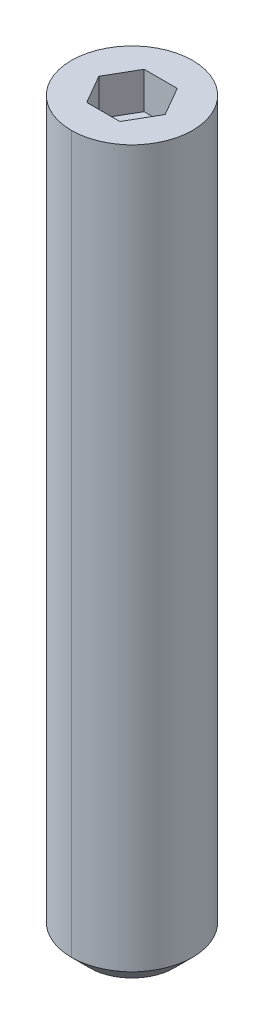
ISO-10303-21;
HEADER;
FILE_DESCRIPTION(('STEP AP214'),'2;1');
FILE_NAME('part.step','',(''),(''),'','','');
FILE_SCHEMA(('AUTOMOTIVE_DESIGN { 1 0 10303 214 1 1 1 1 }'));
ENDSEC;
DATA;
#1=APPLICATION_CONTEXT('core data for automotive mechanical design processes');
#2=APPLICATION_PROTOCOL_DEFINITION('international standard','automotive_design',2000,#1);
#3=PRODUCT_CONTEXT('',#1,'mechanical');
#4=PRODUCT('Part','Part','',(#3));
#5=PRODUCT_RELATED_PRODUCT_CATEGORY('part','',(#4));
#6=PRODUCT_DEFINITION_FORMATION('','',#4);
#7=PRODUCT_DEFINITION_CONTEXT('part definition',#1,'design');
#8=PRODUCT_DEFINITION('design','',#6,#7);
#9=PRODUCT_DEFINITION_SHAPE('','',#8);
#10=(LENGTH_UNIT() NAMED_UNIT(*) SI_UNIT(.MILLI.,.METRE.));
#11=(NAMED_UNIT(*) PLANE_ANGLE_UNIT() SI_UNIT($,.RADIAN.));
#12=(NAMED_UNIT(*) SI_UNIT($,.STERADIAN.) SOLID_ANGLE_UNIT());
#13=UNCERTAINTY_MEASURE_WITH_UNIT(LENGTH_MEASURE(1.E-05),#10,'distance_accuracy_value','');
#14=(GEOMETRIC_REPRESENTATION_CONTEXT(3) GLOBAL_UNCERTAINTY_ASSIGNED_CONTEXT((#13)) GLOBAL_UNIT_ASSIGNED_CONTEXT((#10,
#11,#12)) REPRESENTATION_CONTEXT('',''));
#15=CARTESIAN_POINT('',(0.,0.,0.));
#16=DIRECTION('',(0.,0.,1.));
#17=DIRECTION('',(1.,0.,0.));
#18=AXIS2_PLACEMENT_3D('',#15,#16,#17);
#19=CARTESIAN_POINT('',(-1.14567944042316,11.43,0.));
#20=DIRECTION('',(0.,1.,0.));
#21=DIRECTION('',(1.,0.,0.));
#22=AXIS2_PLACEMENT_3D('',#19,#20,#21);
#23=PLANE('',#22);
#24=DIRECTION('',(-0.5,0.,0.866025403784439));
#25=VECTOR('',#24,1.);
#26=CARTESIAN_POINT('',(-0.572839720211583,11.43,-0.9921875));
#27=LINE('',#26,#25);
#28=CARTESIAN_POINT('',(-0.572839720211583,11.43,-0.9921875));
#29=VERTEX_POINT('',#28);
#30=CARTESIAN_POINT('',(-1.14567944042316,11.43,0.));
#31=VERTEX_POINT('',#30);
#32=EDGE_CURVE('E138',#29,#31,#27,.T.);
#33=ORIENTED_EDGE('',*,*,#32,.T.);
#34=DIRECTION('',(0.5,0.,0.866025403784439));
#35=VECTOR('',#34,1.);
#36=CARTESIAN_POINT('',(-1.14567944042316,11.43,0.));
#37=LINE('',#36,#35);
#38=CARTESIAN_POINT('',(-0.572839720211581,11.43,0.9921875));
#39=VERTEX_POINT('',#38);
#40=EDGE_CURVE('E11',#31,#39,#37,.T.);
#41=ORIENTED_EDGE('',*,*,#40,.T.);
#42=DIRECTION('',(1.,0.,0.));
#43=VECTOR('',#42,1.);
#44=CARTESIAN_POINT('',(-0.572839720211581,11.43,0.9921875));
#45=LINE('',#44,#43);
#46=CARTESIAN_POINT('',(0.572839720211582,11.43,0.9921875));
#47=VERTEX_POINT('',#46);
#48=EDGE_CURVE('E162',#39,#47,#45,.T.);
#49=ORIENTED_EDGE('',*,*,#48,.T.);
#50=DIRECTION('',(0.5,0.,-0.866025403784439));
#51=VECTOR('',#50,1.);
#52=CARTESIAN_POINT('',(0.572839720211582,11.43,0.9921875));
#53=LINE('',#52,#51);
#54=CARTESIAN_POINT('',(1.14567944042316,11.43,0.));
#55=VERTEX_POINT('',#54);
#56=EDGE_CURVE('E148',#47,#55,#53,.T.);
#57=ORIENTED_EDGE('',*,*,#56,.T.);
#58=DIRECTION('',(-0.5,0.,-0.866025403784438));
#59=VECTOR('',#58,1.);
#60=CARTESIAN_POINT('',(1.14567944042316,11.43,0.));
#61=LINE('',#60,#59);
#62=CARTESIAN_POINT('',(0.572839720211582,11.43,-0.9921875));
#63=VERTEX_POINT('',#62);
#64=EDGE_CURVE('E159',#55,#63,#61,.T.);
#65=ORIENTED_EDGE('',*,*,#64,.T.);
#66=DIRECTION('',(-1.,0.,0.));
#67=VECTOR('',#66,1.);
#68=CARTESIAN_POINT('',(0.572839720211582,11.43,-0.9921875));
#69=LINE('',#68,#67);
#70=EDGE_CURVE('E131',#63,#29,#69,.T.);
#71=ORIENTED_EDGE('',*,*,#70,.T.);
#72=EDGE_LOOP('',(#33,#41,#49,#57,#65,#71));
#73=FACE_BOUND('',#72,.T.);
#74=ADVANCED_FACE('F17',(#73),#23,.T.);
#75=CARTESIAN_POINT('',(-1.14567944042316,11.43,0.));
#76=DIRECTION('',(-0.866025403784438,0.,0.5));
#77=DIRECTION('',(0.,1.,0.));
#78=AXIS2_PLACEMENT_3D('',#75,#76,#77);
#79=PLANE('',#78);
#80=DIRECTION('',(0.5,0.,0.866025403784439));
#81=VECTOR('',#80,1.);
#82=CARTESIAN_POINT('',(-1.14567944042316,12.7,0.));
#83=LINE('',#82,#81);
#84=CARTESIAN_POINT('',(-1.14567944042316,12.7,0.));
#85=VERTEX_POINT('',#84);
#86=CARTESIAN_POINT('',(-0.572839720211581,12.7,0.9921875));
#87=VERTEX_POINT('',#86);
#88=EDGE_CURVE('E168',#85,#87,#83,.T.);
#89=ORIENTED_EDGE('',*,*,#88,.T.);
#90=DIRECTION('',(0.,1.,0.));
#91=VECTOR('',#90,1.);
#92=CARTESIAN_POINT('',(-0.572839720211581,11.43,0.9921875));
#93=LINE('',#92,#91);
#94=EDGE_CURVE('E28',#39,#87,#93,.T.);
#95=ORIENTED_EDGE('',*,*,#94,.F.);
#96=ORIENTED_EDGE('',*,*,#40,.F.);
#97=DIRECTION('',(0.,1.,0.));
#98=VECTOR('',#97,1.);
#99=CARTESIAN_POINT('',(-1.14567944042316,11.43,0.));
#100=LINE('',#99,#98);
#101=EDGE_CURVE('E165',#31,#85,#100,.T.);
#102=ORIENTED_EDGE('',*,*,#101,.T.);
#103=EDGE_LOOP('',(#89,#95,#96,#102));
#104=FACE_BOUND('',#103,.T.);
#105=ADVANCED_FACE('F240',(#104),#79,.F.);
#106=CARTESIAN_POINT('',(-0.572839720211581,11.43,0.9921875));
#107=DIRECTION('',(0.,0.,1.));
#108=DIRECTION('',(1.,0.,0.));
#109=AXIS2_PLACEMENT_3D('',#106,#107,#108);
#110=PLANE('',#109);
#111=DIRECTION('',(1.,0.,0.));
#112=VECTOR('',#111,1.);
#113=CARTESIAN_POINT('',(-0.572839720211581,12.7,0.9921875));
#114=LINE('',#113,#112);
#115=CARTESIAN_POINT('',(0.572839720211582,12.7,0.9921875));
#116=VERTEX_POINT('',#115);
#117=EDGE_CURVE('E158',#87,#116,#114,.T.);
#118=ORIENTED_EDGE('',*,*,#117,.T.);
#119=DIRECTION('',(0.,1.,0.));
#120=VECTOR('',#119,1.);
#121=CARTESIAN_POINT('',(0.572839720211582,11.43,0.9921875));
#122=LINE('',#121,#120);
#123=EDGE_CURVE('E152',#47,#116,#122,.T.);
#124=ORIENTED_EDGE('',*,*,#123,.F.);
#125=ORIENTED_EDGE('',*,*,#48,.F.);
#126=ORIENTED_EDGE('',*,*,#94,.T.);
#127=EDGE_LOOP('',(#118,#124,#125,#126));
#128=FACE_BOUND('',#127,.T.);
#129=ADVANCED_FACE('F210',(#128),#110,.F.);
#130=CARTESIAN_POINT('',(1.14567944042316,11.43,0.));
#131=DIRECTION('',(0.866025403784438,0.,-0.5));
#132=DIRECTION('',(0.,-1.,0.));
#133=AXIS2_PLACEMENT_3D('',#130,#131,#132);
#134=PLANE('',#133);
#135=DIRECTION('',(-0.5,0.,-0.866025403784438));
#136=VECTOR('',#135,1.);
#137=CARTESIAN_POINT('',(1.14567944042316,12.7,0.));
#138=LINE('',#137,#136);
#139=CARTESIAN_POINT('',(1.14567944042316,12.7,0.));
#140=VERTEX_POINT('',#139);
#141=CARTESIAN_POINT('',(0.572839720211582,12.7,-0.9921875));
#142=VERTEX_POINT('',#141);
#143=EDGE_CURVE('E21',#140,#142,#138,.T.);
#144=ORIENTED_EDGE('',*,*,#143,.T.);
#145=DIRECTION('',(0.,1.,0.));
#146=VECTOR('',#145,1.);
#147=CARTESIAN_POINT('',(0.572839720211582,11.43,-0.9921875));
#148=LINE('',#147,#146);
#149=EDGE_CURVE('E134',#63,#142,#148,.T.);
#150=ORIENTED_EDGE('',*,*,#149,.F.);
#151=ORIENTED_EDGE('',*,*,#64,.F.);
#152=DIRECTION('',(0.,1.,0.));
#153=VECTOR('',#152,1.);
#154=CARTESIAN_POINT('',(1.14567944042316,11.43,0.));
#155=LINE('',#154,#153);
#156=EDGE_CURVE('E153',#55,#140,#155,.T.);
#157=ORIENTED_EDGE('',*,*,#156,.T.);
#158=EDGE_LOOP('',(#144,#150,#151,#157));
#159=FACE_BOUND('',#158,.T.);
#160=ADVANCED_FACE('F230',(#159),#134,.F.);
#161=CARTESIAN_POINT('',(0.572839720211582,11.43,-0.9921875));
#162=DIRECTION('',(0.,0.,-1.));
#163=DIRECTION('',(0.,-1.,0.));
#164=AXIS2_PLACEMENT_3D('',#161,#162,#163);
#165=PLANE('',#164);
#166=DIRECTION('',(-1.,0.,0.));
#167=VECTOR('',#166,1.);
#168=CARTESIAN_POINT('',(0.572839720211582,12.7,-0.9921875));
#169=LINE('',#168,#167);
#170=CARTESIAN_POINT('',(-0.572839720211583,12.7,-0.9921875));
#171=VERTEX_POINT('',#170);
#172=EDGE_CURVE('E178',#142,#171,#169,.T.);
#173=ORIENTED_EDGE('',*,*,#172,.T.);
#174=DIRECTION('',(0.,1.,0.));
#175=VECTOR('',#174,1.);
#176=CARTESIAN_POINT('',(-0.572839720211583,11.43,-0.9921875));
#177=LINE('',#176,#175);
#178=EDGE_CURVE('E135',#29,#171,#177,.T.);
#179=ORIENTED_EDGE('',*,*,#178,.F.);
#180=ORIENTED_EDGE('',*,*,#70,.F.);
#181=ORIENTED_EDGE('',*,*,#149,.T.);
#182=EDGE_LOOP('',(#173,#179,#180,#181));
#183=FACE_BOUND('',#182,.T.);
#184=ADVANCED_FACE('F234',(#183),#165,.F.);
#185=CARTESIAN_POINT('',(-0.572839720211583,11.43,-0.9921875));
#186=DIRECTION('',(-0.866025403784439,0.,-0.5));
#187=DIRECTION('',(-0.5,0.,0.866025403784439));
#188=AXIS2_PLACEMENT_3D('',#185,#186,#187);
#189=PLANE('',#188);
#190=DIRECTION('',(-0.5,0.,0.866025403784439));
#191=VECTOR('',#190,1.);
#192=CARTESIAN_POINT('',(-0.572839720211583,12.7,-0.9921875));
#193=LINE('',#192,#191);
#194=EDGE_CURVE('E182',#171,#85,#193,.T.);
#195=ORIENTED_EDGE('',*,*,#194,.T.);
#196=ORIENTED_EDGE('',*,*,#101,.F.);
#197=ORIENTED_EDGE('',*,*,#32,.F.);
#198=ORIENTED_EDGE('',*,*,#178,.T.);
#199=EDGE_LOOP('',(#195,#196,#197,#198));
#200=FACE_BOUND('',#199,.T.);
#201=ADVANCED_FACE('F238',(#200),#189,.F.);
#202=CARTESIAN_POINT('',(0.572839720211582,11.43,0.9921875));
#203=DIRECTION('',(0.866025403784439,0.,0.5));
#204=DIRECTION('',(0.,-1.,0.));
#205=AXIS2_PLACEMENT_3D('',#202,#203,#204);
#206=PLANE('',#205);
#207=DIRECTION('',(0.5,0.,-0.866025403784439));
#208=VECTOR('',#207,1.);
#209=CARTESIAN_POINT('',(0.572839720211582,12.7,0.9921875));
#210=LINE('',#209,#208);
#211=EDGE_CURVE('E154',#116,#140,#210,.T.);
#212=ORIENTED_EDGE('',*,*,#211,.T.);
#213=ORIENTED_EDGE('',*,*,#156,.F.);
#214=ORIENTED_EDGE('',*,*,#56,.F.);
#215=ORIENTED_EDGE('',*,*,#123,.T.);
#216=EDGE_LOOP('',(#212,#213,#214,#215));
#217=FACE_BOUND('',#216,.T.);
#218=ADVANCED_FACE('F222',(#217),#206,.F.);
#219=CARTESIAN_POINT('',(0.,12.7,0.));
#220=DIRECTION('',(0.,1.,0.));
#221=DIRECTION('',(1.,0.,0.));
#222=AXIS2_PLACEMENT_3D('',#219,#220,#221);
#223=PLANE('',#222);
#224=ORIENTED_EDGE('',*,*,#194,.F.);
#225=ORIENTED_EDGE('',*,*,#172,.F.);
#226=ORIENTED_EDGE('',*,*,#143,.F.);
#227=ORIENTED_EDGE('',*,*,#211,.F.);
#228=ORIENTED_EDGE('',*,*,#117,.F.);
#229=ORIENTED_EDGE('',*,*,#88,.F.);
#230=EDGE_LOOP('',(#224,#225,#226,#227,#228,#229));
#231=FACE_BOUND('',#230,.T.);
#232=CARTESIAN_POINT('',(0.,12.7,0.));
#233=DIRECTION('',(0.,1.,0.));
#234=DIRECTION('',(0.,0.,1.));
#235=AXIS2_PLACEMENT_3D('',#232,#233,#234);
#236=CIRCLE('',#235,2.0955);
#237=CARTESIAN_POINT('',(0.,12.7,-2.0955));
#238=VERTEX_POINT('',#237);
#239=CARTESIAN_POINT('',(0.,12.7,2.0955));
#240=VERTEX_POINT('',#239);
#241=EDGE_CURVE('E142',#238,#240,#236,.T.);
#242=ORIENTED_EDGE('',*,*,#241,.T.);
#243=CARTESIAN_POINT('',(0.,12.7,0.));
#244=DIRECTION('',(0.,1.,0.));
#245=DIRECTION('',(0.,0.,1.));
#246=AXIS2_PLACEMENT_3D('',#243,#244,#245);
#247=CIRCLE('',#246,2.0955);
#248=EDGE_CURVE('E141',#240,#238,#247,.T.);
#249=ORIENTED_EDGE('',*,*,#248,.T.);
#250=EDGE_LOOP('',(#242,#249));
#251=FACE_BOUND('',#250,.T.);
#252=ADVANCED_FACE('F19',(#231,#251),#223,.T.);
#253=CARTESIAN_POINT('',(0.,12.7,0.));
#254=DIRECTION('',(0.,-1.,0.));
#255=DIRECTION('',(0.,0.,-1.));
#256=AXIS2_PLACEMENT_3D('',#253,#254,#255);
#257=CYLINDRICAL_SURFACE('',#256,2.0955);
#258=ORIENTED_EDGE('',*,*,#248,.F.);
#259=DIRECTION('',(0.,-1.,0.));
#260=VECTOR('',#259,1.);
#261=CARTESIAN_POINT('',(0.,12.7,2.0955));
#262=LINE('',#261,#260);
#263=CARTESIAN_POINT('',(0.,-12.065,2.0955));
#264=VERTEX_POINT('',#263);
#265=EDGE_CURVE('E147',#240,#264,#262,.T.);
#266=ORIENTED_EDGE('',*,*,#265,.T.);
#267=CARTESIAN_POINT('',(0.,-12.065,0.));
#268=DIRECTION('',(0.,1.,0.));
#269=DIRECTION('',(0.,0.,1.));
#270=AXIS2_PLACEMENT_3D('',#267,#268,#269);
#271=CIRCLE('',#270,2.0955);
#272=CARTESIAN_POINT('',(0.,-12.065,-2.0955));
#273=VERTEX_POINT('',#272);
#274=EDGE_CURVE('E116',#264,#273,#271,.T.);
#275=ORIENTED_EDGE('',*,*,#274,.T.);
#276=DIRECTION('',(0.,-1.,0.));
#277=VECTOR('',#276,1.);
#278=CARTESIAN_POINT('',(0.,12.7,-2.0955));
#279=LINE('',#278,#277);
#280=EDGE_CURVE('E139',#238,#273,#279,.T.);
#281=ORIENTED_EDGE('',*,*,#280,.F.);
#282=EDGE_LOOP('',(#258,#266,#275,#281));
#283=FACE_BOUND('',#282,.T.);
#284=ADVANCED_FACE('F251',(#283),#257,.T.);
#285=CARTESIAN_POINT('',(0.,-12.7,0.));
#286=DIRECTION('',(0.,1.,0.));
#287=DIRECTION('',(1.,0.,0.));
#288=AXIS2_PLACEMENT_3D('',#285,#286,#287);
#289=PLANE('',#288);
#290=CARTESIAN_POINT('',(0.,-12.7,0.));
#291=DIRECTION('',(0.,-1.,0.));
#292=DIRECTION('',(0.,0.,1.));
#293=AXIS2_PLACEMENT_3D('',#290,#291,#292);
#294=CIRCLE('',#293,1.4605);
#295=CARTESIAN_POINT('',(0.,-12.7,1.4605));
#296=VERTEX_POINT('',#295);
#297=CARTESIAN_POINT('',(0.,-12.7,-1.4605));
#298=VERTEX_POINT('',#297);
#299=EDGE_CURVE('E119',#296,#298,#294,.T.);
#300=ORIENTED_EDGE('',*,*,#299,.T.);
#301=CARTESIAN_POINT('',(0.,-12.7,0.));
#302=DIRECTION('',(0.,-1.,0.));
#303=DIRECTION('',(0.,0.,1.));
#304=AXIS2_PLACEMENT_3D('',#301,#302,#303);
#305=CIRCLE('',#304,1.4605);
#306=EDGE_CURVE('E105',#298,#296,#305,.T.);
#307=ORIENTED_EDGE('',*,*,#306,.T.);
#308=EDGE_LOOP('',(#300,#307));
#309=FACE_BOUND('',#308,.T.);
#310=ADVANCED_FACE('F120',(#309),#289,.F.);
#311=CARTESIAN_POINT('',(0.,12.7,0.));
#312=DIRECTION('',(0.,-1.,0.));
#313=DIRECTION('',(0.,0.,-1.));
#314=AXIS2_PLACEMENT_3D('',#311,#312,#313);
#315=CYLINDRICAL_SURFACE('',#314,2.0955);
#316=ORIENTED_EDGE('',*,*,#265,.F.);
#317=ORIENTED_EDGE('',*,*,#241,.F.);
#318=ORIENTED_EDGE('',*,*,#280,.T.);
#319=CARTESIAN_POINT('',(0.,-12.065,0.));
#320=DIRECTION('',(0.,1.,0.));
#321=DIRECTION('',(0.,0.,1.));
#322=AXIS2_PLACEMENT_3D('',#319,#320,#321);
#323=CIRCLE('',#322,2.0955);
#324=EDGE_CURVE('E117',#273,#264,#323,.T.);
#325=ORIENTED_EDGE('',*,*,#324,.T.);
#326=EDGE_LOOP('',(#316,#317,#318,#325));
#327=FACE_BOUND('',#326,.T.);
#328=ADVANCED_FACE('F257',(#327),#315,.T.);
#329=CARTESIAN_POINT('',(0.,-12.065,0.));
#330=DIRECTION('',(0.,1.,0.));
#331=DIRECTION('',(0.,0.,1.));
#332=AXIS2_PLACEMENT_3D('',#329,#330,#331);
#333=CONICAL_SURFACE('',#332,2.0955,0.785398163397448);
#334=ORIENTED_EDGE('',*,*,#306,.F.);
#335=DIRECTION('',(0.,0.707106781186548,-0.707106781186548));
#336=VECTOR('',#335,1.);
#337=CARTESIAN_POINT('',(0.,-12.065,-2.0955));
#338=LINE('',#337,#336);
#339=EDGE_CURVE('E110',#298,#273,#338,.T.);
#340=ORIENTED_EDGE('',*,*,#339,.T.);
#341=ORIENTED_EDGE('',*,*,#274,.F.);
#342=DIRECTION('',(0.,0.707106781186548,0.707106781186548));
#343=VECTOR('',#342,1.);
#344=CARTESIAN_POINT('',(0.,-12.065,2.0955));
#345=LINE('',#344,#343);
#346=EDGE_CURVE('E112',#296,#264,#345,.T.);
#347=ORIENTED_EDGE('',*,*,#346,.F.);
#348=EDGE_LOOP('',(#334,#340,#341,#347));
#349=FACE_BOUND('',#348,.T.);
#350=ADVANCED_FACE('F107',(#349),#333,.T.);
#351=CARTESIAN_POINT('',(0.,-12.065,0.));
#352=DIRECTION('',(0.,1.,0.));
#353=DIRECTION('',(0.,0.,1.));
#354=AXIS2_PLACEMENT_3D('',#351,#352,#353);
#355=CONICAL_SURFACE('',#354,2.0955,0.785398163397448);
#356=ORIENTED_EDGE('',*,*,#339,.F.);
#357=ORIENTED_EDGE('',*,*,#299,.F.);
#358=ORIENTED_EDGE('',*,*,#346,.T.);
#359=ORIENTED_EDGE('',*,*,#324,.F.);
#360=EDGE_LOOP('',(#356,#357,#358,#359));
#361=FACE_BOUND('',#360,.T.);
#362=ADVANCED_FACE('F124',(#361),#355,.T.);
#363=CLOSED_SHELL('',(#74,#105,#129,#160,#184,#201,#218,#252,#284,#310,#328,#350,#362));
#364=MANIFOLD_SOLID_BREP('B1',#363);
#365=ADVANCED_BREP_SHAPE_REPRESENTATION('',(#18,#364),#14);
#366=SHAPE_DEFINITION_REPRESENTATION(#9,#365);
ENDSEC;
END-ISO-10303-21;
